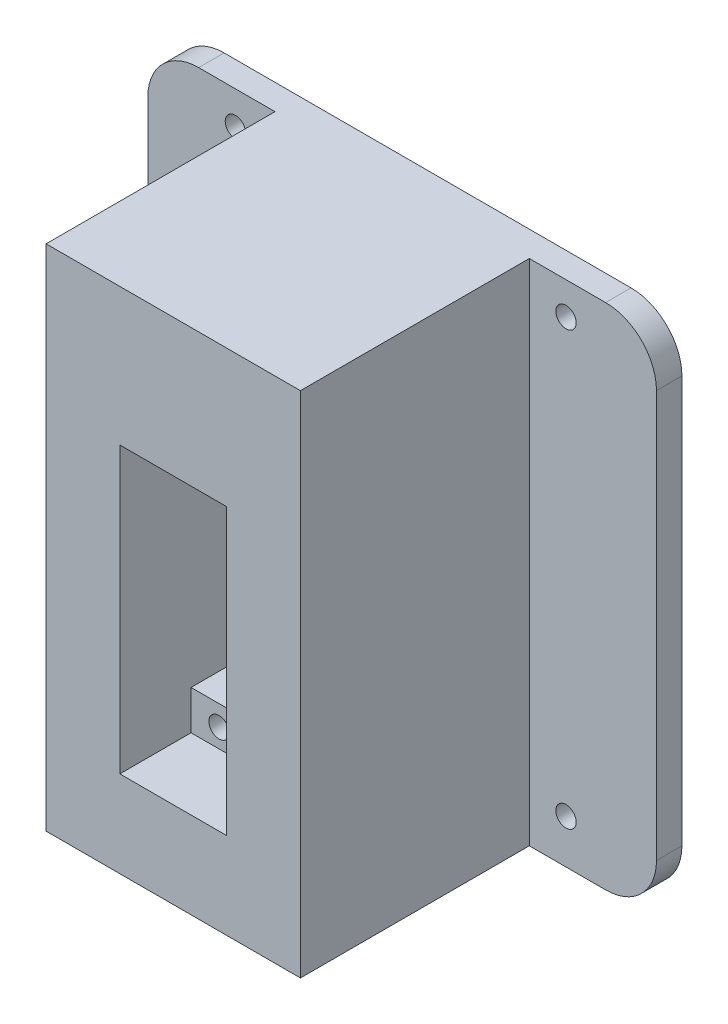
ISO-10303-21;
HEADER;
FILE_DESCRIPTION(('STEP AP214'),'2;1');
FILE_NAME('part.step','',(''),(''),'','','');
FILE_SCHEMA(('AUTOMOTIVE_DESIGN { 1 0 10303 214 1 1 1 1 }'));
ENDSEC;
DATA;
#1=APPLICATION_CONTEXT('core data for automotive mechanical design processes');
#2=APPLICATION_PROTOCOL_DEFINITION('international standard','automotive_design',2000,#1);
#3=PRODUCT_CONTEXT('',#1,'mechanical');
#4=PRODUCT('Part','Part','',(#3));
#5=PRODUCT_RELATED_PRODUCT_CATEGORY('part','',(#4));
#6=PRODUCT_DEFINITION_FORMATION('','',#4);
#7=PRODUCT_DEFINITION_CONTEXT('part definition',#1,'design');
#8=PRODUCT_DEFINITION('design','',#6,#7);
#9=PRODUCT_DEFINITION_SHAPE('','',#8);
#10=(LENGTH_UNIT() NAMED_UNIT(*) SI_UNIT(.MILLI.,.METRE.));
#11=(NAMED_UNIT(*) PLANE_ANGLE_UNIT() SI_UNIT($,.RADIAN.));
#12=(NAMED_UNIT(*) SI_UNIT($,.STERADIAN.) SOLID_ANGLE_UNIT());
#13=UNCERTAINTY_MEASURE_WITH_UNIT(LENGTH_MEASURE(1.E-05),#10,'distance_accuracy_value','');
#14=(GEOMETRIC_REPRESENTATION_CONTEXT(3) GLOBAL_UNCERTAINTY_ASSIGNED_CONTEXT((#13)) GLOBAL_UNIT_ASSIGNED_CONTEXT((#10,
#11,#12)) REPRESENTATION_CONTEXT('',''));
#15=CARTESIAN_POINT('',(0.,0.,0.));
#16=DIRECTION('',(0.,0.,1.));
#17=DIRECTION('',(1.,0.,0.));
#18=AXIS2_PLACEMENT_3D('',#15,#16,#17);
#19=CARTESIAN_POINT('',(-40.,40.,50.));
#20=DIRECTION('',(0.,0.,-1.));
#21=DIRECTION('',(-1.,0.,0.));
#22=AXIS2_PLACEMENT_3D('',#19,#20,#21);
#23=CYLINDRICAL_SURFACE('',#22,9.99999999999999);
#24=CARTESIAN_POINT('',(-40.,40.,5.));
#25=DIRECTION('',(0.,0.,1.));
#26=DIRECTION('',(1.,0.,0.));
#27=AXIS2_PLACEMENT_3D('',#24,#25,#26);
#28=CIRCLE('',#27,9.99999999999999);
#29=CARTESIAN_POINT('',(-39.9999999999999,50.,5.));
#30=VERTEX_POINT('',#29);
#31=CARTESIAN_POINT('',(-50.,39.9999999999999,5.));
#32=VERTEX_POINT('',#31);
#33=EDGE_CURVE('E238',#30,#32,#28,.T.);
#34=ORIENTED_EDGE('',*,*,#33,.F.);
#35=DIRECTION('',(0.,0.,-1.));
#36=VECTOR('',#35,1.);
#37=CARTESIAN_POINT('',(-39.9999999999999,50.,50.));
#38=LINE('',#37,#36);
#39=CARTESIAN_POINT('',(-39.9999999999999,50.,0.));
#40=VERTEX_POINT('',#39);
#41=EDGE_CURVE('E331',#30,#40,#38,.T.);
#42=ORIENTED_EDGE('',*,*,#41,.T.);
#43=CARTESIAN_POINT('',(-40.,40.,0.));
#44=DIRECTION('',(0.,0.,1.));
#45=DIRECTION('',(1.,0.,0.));
#46=AXIS2_PLACEMENT_3D('',#43,#44,#45);
#47=CIRCLE('',#46,9.99999999999999);
#48=CARTESIAN_POINT('',(-50.,39.9999999999999,0.));
#49=VERTEX_POINT('',#48);
#50=EDGE_CURVE('E318',#40,#49,#47,.T.);
#51=ORIENTED_EDGE('',*,*,#50,.T.);
#52=DIRECTION('',(0.,0.,-1.));
#53=VECTOR('',#52,1.);
#54=CARTESIAN_POINT('',(-50.,39.9999999999999,50.));
#55=LINE('',#54,#53);
#56=EDGE_CURVE('E365',#32,#49,#55,.T.);
#57=ORIENTED_EDGE('',*,*,#56,.F.);
#58=EDGE_LOOP('',(#34,#42,#51,#57));
#59=FACE_BOUND('',#58,.T.);
#60=ADVANCED_FACE('F33',(#59),#23,.T.);
#61=CARTESIAN_POINT('',(-50.,39.9999999999999,50.));
#62=DIRECTION('',(1.,0.,0.));
#63=DIRECTION('',(0.,0.,-1.));
#64=AXIS2_PLACEMENT_3D('',#61,#62,#63);
#65=PLANE('',#64);
#66=DIRECTION('',(0.,-1.,0.));
#67=VECTOR('',#66,1.);
#68=CARTESIAN_POINT('',(-50.,-39.9999999999999,5.));
#69=LINE('',#68,#67);
#70=CARTESIAN_POINT('',(-50.,-39.9999999999999,5.));
#71=VERTEX_POINT('',#70);
#72=EDGE_CURVE('E240',#32,#71,#69,.T.);
#73=ORIENTED_EDGE('',*,*,#72,.F.);
#74=ORIENTED_EDGE('',*,*,#56,.T.);
#75=DIRECTION('',(0.,-1.,0.));
#76=VECTOR('',#75,1.);
#77=CARTESIAN_POINT('',(-50.,39.9999999999999,0.));
#78=LINE('',#77,#76);
#79=CARTESIAN_POINT('',(-50.,-39.9999999999999,0.));
#80=VERTEX_POINT('',#79);
#81=EDGE_CURVE('E334',#49,#80,#78,.T.);
#82=ORIENTED_EDGE('',*,*,#81,.T.);
#83=DIRECTION('',(0.,0.,-1.));
#84=VECTOR('',#83,1.);
#85=CARTESIAN_POINT('',(-50.,-39.9999999999999,50.));
#86=LINE('',#85,#84);
#87=EDGE_CURVE('E363',#71,#80,#86,.T.);
#88=ORIENTED_EDGE('',*,*,#87,.F.);
#89=EDGE_LOOP('',(#73,#74,#82,#88));
#90=FACE_BOUND('',#89,.T.);
#91=ADVANCED_FACE('F453',(#90),#65,.F.);
#92=CARTESIAN_POINT('',(-40.,-40.,50.));
#93=DIRECTION('',(0.,0.,-1.));
#94=DIRECTION('',(-1.,0.,0.));
#95=AXIS2_PLACEMENT_3D('',#92,#93,#94);
#96=CYLINDRICAL_SURFACE('',#95,10.);
#97=DIRECTION('',(0.,0.,-1.));
#98=VECTOR('',#97,1.);
#99=CARTESIAN_POINT('',(-39.9999999999999,-50.,50.));
#100=LINE('',#99,#98);
#101=CARTESIAN_POINT('',(-39.9999999999999,-50.,5.));
#102=VERTEX_POINT('',#101);
#103=CARTESIAN_POINT('',(-39.9999999999999,-50.,0.));
#104=VERTEX_POINT('',#103);
#105=EDGE_CURVE('E361',#102,#104,#100,.T.);
#106=ORIENTED_EDGE('',*,*,#105,.F.);
#107=CARTESIAN_POINT('',(-40.,-40.,5.));
#108=DIRECTION('',(0.,0.,1.));
#109=DIRECTION('',(1.,0.,0.));
#110=AXIS2_PLACEMENT_3D('',#107,#108,#109);
#111=CIRCLE('',#110,9.99999999999999);
#112=EDGE_CURVE('E242',#71,#102,#111,.T.);
#113=ORIENTED_EDGE('',*,*,#112,.F.);
#114=ORIENTED_EDGE('',*,*,#87,.T.);
#115=CARTESIAN_POINT('',(-40.,-40.,0.));
#116=DIRECTION('',(0.,0.,-1.));
#117=DIRECTION('',(-1.,0.,0.));
#118=AXIS2_PLACEMENT_3D('',#115,#116,#117);
#119=CIRCLE('',#118,10.);
#120=EDGE_CURVE('E337',#104,#80,#119,.T.);
#121=ORIENTED_EDGE('',*,*,#120,.F.);
#122=EDGE_LOOP('',(#106,#113,#114,#121));
#123=FACE_BOUND('',#122,.T.);
#124=ADVANCED_FACE('F458',(#123),#96,.T.);
#125=CARTESIAN_POINT('',(0.,0.,36.));
#126=DIRECTION('',(0.,0.,1.));
#127=DIRECTION('',(1.,0.,0.));
#128=AXIS2_PLACEMENT_3D('',#125,#126,#127);
#129=PLANE('',#128);
#130=CARTESIAN_POINT('',(5.,19.5,36.));
#131=DIRECTION('',(0.,0.,1.));
#132=DIRECTION('',(1.,0.,0.));
#133=AXIS2_PLACEMENT_3D('',#130,#131,#132);
#134=CIRCLE('',#133,2.);
#135=CARTESIAN_POINT('',(7.,19.5,36.));
#136=VERTEX_POINT('',#135);
#137=EDGE_CURVE('E826',#136,#136,#134,.T.);
#138=ORIENTED_EDGE('',*,*,#137,.F.);
#139=EDGE_LOOP('',(#138));
#140=FACE_BOUND('',#139,.T.);
#141=DIRECTION('',(-1.,0.,0.));
#142=VECTOR('',#141,1.);
#143=CARTESIAN_POINT('',(2.75,16.2200002549946,36.));
#144=LINE('',#143,#142);
#145=CARTESIAN_POINT('',(10.5,16.2200002549946,36.));
#146=VERTEX_POINT('',#145);
#147=CARTESIAN_POINT('',(2.75,16.2200002549946,36.));
#148=VERTEX_POINT('',#147);
#149=EDGE_CURVE('E230',#146,#148,#144,.T.);
#150=ORIENTED_EDGE('',*,*,#149,.F.);
#151=DIRECTION('',(0.,1.,0.));
#152=VECTOR('',#151,1.);
#153=CARTESIAN_POINT('',(10.5,-33.,36.));
#154=LINE('',#153,#152);
#155=CARTESIAN_POINT('',(10.5,23.,36.));
#156=VERTEX_POINT('',#155);
#157=EDGE_CURVE('E296',#146,#156,#154,.T.);
#158=ORIENTED_EDGE('',*,*,#157,.T.);
#159=DIRECTION('',(-1.,0.,0.));
#160=VECTOR('',#159,1.);
#161=CARTESIAN_POINT('',(10.5,23.,36.));
#162=LINE('',#161,#160);
#163=CARTESIAN_POINT('',(2.73061146028868,23.,36.));
#164=VERTEX_POINT('',#163);
#165=EDGE_CURVE('E301',#156,#164,#162,.T.);
#166=ORIENTED_EDGE('',*,*,#165,.T.);
#167=DIRECTION('',(-0.00285965503897239,0.99999591117817,0.));
#168=VECTOR('',#167,1.);
#169=CARTESIAN_POINT('',(2.75,16.2200002549946,36.));
#170=LINE('',#169,#168);
#171=EDGE_CURVE('E256',#148,#164,#170,.T.);
#172=ORIENTED_EDGE('',*,*,#171,.F.);
#173=EDGE_LOOP('',(#150,#158,#166,#172));
#174=FACE_BOUND('',#173,.T.);
#175=ADVANCED_FACE('F412',(#140,#174),#129,.T.);
#176=CARTESIAN_POINT('',(-5.,19.5,36.));
#177=DIRECTION('',(0.,0.,1.));
#178=DIRECTION('',(1.,0.,0.));
#179=AXIS2_PLACEMENT_3D('',#176,#177,#178);
#180=CIRCLE('',#179,2.);
#181=CARTESIAN_POINT('',(-3.,19.5,36.));
#182=VERTEX_POINT('',#181);
#183=EDGE_CURVE('E839',#182,#182,#180,.T.);
#184=ORIENTED_EDGE('',*,*,#183,.F.);
#185=EDGE_LOOP('',(#184));
#186=FACE_BOUND('',#185,.T.);
#187=DIRECTION('',(0.00285965503897193,-0.99999591117817,0.));
#188=VECTOR('',#187,1.);
#189=CARTESIAN_POINT('',(-2.75,16.2200002549947,36.));
#190=LINE('',#189,#188);
#191=CARTESIAN_POINT('',(-2.76938853971132,23.,36.));
#192=VERTEX_POINT('',#191);
#193=CARTESIAN_POINT('',(-2.75,16.2200002549947,36.));
#194=VERTEX_POINT('',#193);
#195=EDGE_CURVE('E262',#192,#194,#190,.T.);
#196=ORIENTED_EDGE('',*,*,#195,.F.);
#197=CARTESIAN_POINT('',(-10.5,23.,36.));
#198=VERTEX_POINT('',#197);
#199=EDGE_CURVE('E300',#192,#198,#162,.T.);
#200=ORIENTED_EDGE('',*,*,#199,.T.);
#201=DIRECTION('',(0.,-1.,0.));
#202=VECTOR('',#201,1.);
#203=CARTESIAN_POINT('',(-10.5,-33.,36.));
#204=LINE('',#203,#202);
#205=CARTESIAN_POINT('',(-10.5,16.2200002549947,36.));
#206=VERTEX_POINT('',#205);
#207=EDGE_CURVE('E289',#198,#206,#204,.T.);
#208=ORIENTED_EDGE('',*,*,#207,.T.);
#209=DIRECTION('',(-1.,0.,0.));
#210=VECTOR('',#209,1.);
#211=CARTESIAN_POINT('',(-2.75,16.2200002549947,36.));
#212=LINE('',#211,#210);
#213=EDGE_CURVE('E266',#194,#206,#212,.T.);
#214=ORIENTED_EDGE('',*,*,#213,.F.);
#215=EDGE_LOOP('',(#196,#200,#208,#214));
#216=FACE_BOUND('',#215,.T.);
#217=ADVANCED_FACE('F429',(#186,#216),#129,.T.);
#218=CARTESIAN_POINT('',(-39.9999999999999,-50.,50.));
#219=DIRECTION('',(0.,1.,0.));
#220=DIRECTION('',(0.,0.,1.));
#221=AXIS2_PLACEMENT_3D('',#218,#219,#220);
#222=PLANE('',#221);
#223=DIRECTION('',(1.,0.,0.));
#224=VECTOR('',#223,1.);
#225=CARTESIAN_POINT('',(40.,-50.,5.));
#226=LINE('',#225,#224);
#227=CARTESIAN_POINT('',(25.,-50.,5.));
#228=VERTEX_POINT('',#227);
#229=CARTESIAN_POINT('',(40.,-50.,5.));
#230=VERTEX_POINT('',#229);
#231=EDGE_CURVE('E211',#228,#230,#226,.T.);
#232=ORIENTED_EDGE('',*,*,#231,.F.);
#233=DIRECTION('',(0.,0.,1.));
#234=VECTOR('',#233,1.);
#235=CARTESIAN_POINT('',(25.,-50.,5.));
#236=LINE('',#235,#234);
#237=CARTESIAN_POINT('',(25.,-50.,50.));
#238=VERTEX_POINT('',#237);
#239=EDGE_CURVE('E197',#228,#238,#236,.T.);
#240=ORIENTED_EDGE('',*,*,#239,.T.);
#241=DIRECTION('',(1.,0.,0.));
#242=VECTOR('',#241,1.);
#243=CARTESIAN_POINT('',(-39.9999999999999,-50.,50.));
#244=LINE('',#243,#242);
#245=CARTESIAN_POINT('',(-25.,-50.,50.));
#246=VERTEX_POINT('',#245);
#247=EDGE_CURVE('E325',#246,#238,#244,.T.);
#248=ORIENTED_EDGE('',*,*,#247,.F.);
#249=DIRECTION('',(0.,0.,1.));
#250=VECTOR('',#249,1.);
#251=CARTESIAN_POINT('',(-25.,-50.,5.));
#252=LINE('',#251,#250);
#253=CARTESIAN_POINT('',(-25.,-50.,5.));
#254=VERTEX_POINT('',#253);
#255=EDGE_CURVE('E55',#254,#246,#252,.T.);
#256=ORIENTED_EDGE('',*,*,#255,.F.);
#257=DIRECTION('',(1.,0.,0.));
#258=VECTOR('',#257,1.);
#259=CARTESIAN_POINT('',(-39.9999999999999,-50.,5.));
#260=LINE('',#259,#258);
#261=EDGE_CURVE('E244',#102,#254,#260,.T.);
#262=ORIENTED_EDGE('',*,*,#261,.F.);
#263=ORIENTED_EDGE('',*,*,#105,.T.);
#264=DIRECTION('',(1.,0.,0.));
#265=VECTOR('',#264,1.);
#266=CARTESIAN_POINT('',(-39.9999999999999,-50.,0.));
#267=LINE('',#266,#265);
#268=CARTESIAN_POINT('',(40.,-50.,0.));
#269=VERTEX_POINT('',#268);
#270=EDGE_CURVE('E340',#104,#269,#267,.T.);
#271=ORIENTED_EDGE('',*,*,#270,.T.);
#272=DIRECTION('',(0.,0.,-1.));
#273=VECTOR('',#272,1.);
#274=CARTESIAN_POINT('',(40.,-50.,50.));
#275=LINE('',#274,#273);
#276=EDGE_CURVE('E218',#230,#269,#275,.T.);
#277=ORIENTED_EDGE('',*,*,#276,.F.);
#278=EDGE_LOOP('',(#232,#240,#248,#256,#262,#263,#271,#277));
#279=FACE_BOUND('',#278,.T.);
#280=ADVANCED_FACE('F216',(#279),#222,.F.);
#281=CARTESIAN_POINT('',(40.,-40.,50.));
#282=DIRECTION('',(0.,0.,-1.));
#283=DIRECTION('',(-1.,0.,0.));
#284=AXIS2_PLACEMENT_3D('',#281,#282,#283);
#285=CYLINDRICAL_SURFACE('',#284,10.);
#286=CARTESIAN_POINT('',(40.,-40.,5.));
#287=DIRECTION('',(0.,0.,1.));
#288=DIRECTION('',(-1.,0.,0.));
#289=AXIS2_PLACEMENT_3D('',#286,#287,#288);
#290=CIRCLE('',#289,9.99999999999999);
#291=CARTESIAN_POINT('',(50.,-39.9999999999999,5.));
#292=VERTEX_POINT('',#291);
#293=EDGE_CURVE('E219',#230,#292,#290,.T.);
#294=ORIENTED_EDGE('',*,*,#293,.F.);
#295=ORIENTED_EDGE('',*,*,#276,.T.);
#296=CARTESIAN_POINT('',(40.,-40.,0.));
#297=DIRECTION('',(0.,0.,-1.));
#298=DIRECTION('',(-1.,0.,0.));
#299=AXIS2_PLACEMENT_3D('',#296,#297,#298);
#300=CIRCLE('',#299,10.);
#301=CARTESIAN_POINT('',(50.,-39.9999999999999,0.));
#302=VERTEX_POINT('',#301);
#303=EDGE_CURVE('E342',#302,#269,#300,.T.);
#304=ORIENTED_EDGE('',*,*,#303,.F.);
#305=DIRECTION('',(0.,0.,-1.));
#306=VECTOR('',#305,1.);
#307=CARTESIAN_POINT('',(50.,-39.9999999999999,50.));
#308=LINE('',#307,#306);
#309=EDGE_CURVE('E358',#292,#302,#308,.T.);
#310=ORIENTED_EDGE('',*,*,#309,.F.);
#311=EDGE_LOOP('',(#294,#295,#304,#310));
#312=FACE_BOUND('',#311,.T.);
#313=ADVANCED_FACE('F485',(#312),#285,.T.);
#314=CARTESIAN_POINT('',(50.,39.9999999999999,50.));
#315=DIRECTION('',(1.,0.,0.));
#316=DIRECTION('',(0.,1.,0.));
#317=AXIS2_PLACEMENT_3D('',#314,#315,#316);
#318=PLANE('',#317);
#319=DIRECTION('',(0.,1.,0.));
#320=VECTOR('',#319,1.);
#321=CARTESIAN_POINT('',(50.,-39.9999999999999,5.));
#322=LINE('',#321,#320);
#323=CARTESIAN_POINT('',(50.,39.9999999999999,5.));
#324=VERTEX_POINT('',#323);
#325=EDGE_CURVE('E221',#292,#324,#322,.T.);
#326=ORIENTED_EDGE('',*,*,#325,.F.);
#327=ORIENTED_EDGE('',*,*,#309,.T.);
#328=DIRECTION('',(0.,-1.,0.));
#329=VECTOR('',#328,1.);
#330=CARTESIAN_POINT('',(50.,39.9999999999999,0.));
#331=LINE('',#330,#329);
#332=CARTESIAN_POINT('',(50.,39.9999999999999,0.));
#333=VERTEX_POINT('',#332);
#334=EDGE_CURVE('E345',#333,#302,#331,.T.);
#335=ORIENTED_EDGE('',*,*,#334,.F.);
#336=DIRECTION('',(0.,0.,-1.));
#337=VECTOR('',#336,1.);
#338=CARTESIAN_POINT('',(50.,39.9999999999999,50.));
#339=LINE('',#338,#337);
#340=EDGE_CURVE('E356',#324,#333,#339,.T.);
#341=ORIENTED_EDGE('',*,*,#340,.F.);
#342=EDGE_LOOP('',(#326,#327,#335,#341));
#343=FACE_BOUND('',#342,.T.);
#344=ADVANCED_FACE('F490',(#343),#318,.T.);
#345=CARTESIAN_POINT('',(40.,40.,50.));
#346=DIRECTION('',(0.,0.,-1.));
#347=DIRECTION('',(-1.,0.,0.));
#348=AXIS2_PLACEMENT_3D('',#345,#346,#347);
#349=CYLINDRICAL_SURFACE('',#348,10.);
#350=DIRECTION('',(0.,0.,-1.));
#351=VECTOR('',#350,1.);
#352=CARTESIAN_POINT('',(39.9999999999999,50.,50.));
#353=LINE('',#352,#351);
#354=CARTESIAN_POINT('',(40.,50.,5.));
#355=VERTEX_POINT('',#354);
#356=CARTESIAN_POINT('',(39.9999999999999,50.,0.));
#357=VERTEX_POINT('',#356);
#358=EDGE_CURVE('E354',#355,#357,#353,.T.);
#359=ORIENTED_EDGE('',*,*,#358,.F.);
#360=CARTESIAN_POINT('',(40.,40.,5.));
#361=DIRECTION('',(0.,0.,1.));
#362=DIRECTION('',(-1.,0.,0.));
#363=AXIS2_PLACEMENT_3D('',#360,#361,#362);
#364=CIRCLE('',#363,9.99999999999999);
#365=EDGE_CURVE('E226',#324,#355,#364,.T.);
#366=ORIENTED_EDGE('',*,*,#365,.F.);
#367=ORIENTED_EDGE('',*,*,#340,.T.);
#368=CARTESIAN_POINT('',(40.,40.,0.));
#369=DIRECTION('',(0.,0.,1.));
#370=DIRECTION('',(1.,0.,0.));
#371=AXIS2_PLACEMENT_3D('',#368,#369,#370);
#372=CIRCLE('',#371,10.);
#373=EDGE_CURVE('E348',#333,#357,#372,.T.);
#374=ORIENTED_EDGE('',*,*,#373,.T.);
#375=EDGE_LOOP('',(#359,#366,#367,#374));
#376=FACE_BOUND('',#375,.T.);
#377=ADVANCED_FACE('F492',(#376),#349,.T.);
#378=CARTESIAN_POINT('',(-39.9999999999999,50.,50.));
#379=DIRECTION('',(0.,1.,0.));
#380=DIRECTION('',(0.,0.,1.));
#381=AXIS2_PLACEMENT_3D('',#378,#379,#380);
#382=PLANE('',#381);
#383=DIRECTION('',(0.,0.,1.));
#384=VECTOR('',#383,1.);
#385=CARTESIAN_POINT('',(25.,50.,5.));
#386=LINE('',#385,#384);
#387=CARTESIAN_POINT('',(25.,50.,5.));
#388=VERTEX_POINT('',#387);
#389=CARTESIAN_POINT('',(25.,50.,50.));
#390=VERTEX_POINT('',#389);
#391=EDGE_CURVE('E47',#388,#390,#386,.T.);
#392=ORIENTED_EDGE('',*,*,#391,.F.);
#393=DIRECTION('',(-1.,0.,0.));
#394=VECTOR('',#393,1.);
#395=CARTESIAN_POINT('',(40.,50.,5.));
#396=LINE('',#395,#394);
#397=EDGE_CURVE('E207',#355,#388,#396,.T.);
#398=ORIENTED_EDGE('',*,*,#397,.F.);
#399=ORIENTED_EDGE('',*,*,#358,.T.);
#400=DIRECTION('',(1.,0.,0.));
#401=VECTOR('',#400,1.);
#402=CARTESIAN_POINT('',(-39.9999999999999,50.,0.));
#403=LINE('',#402,#401);
#404=EDGE_CURVE('E328',#40,#357,#403,.T.);
#405=ORIENTED_EDGE('',*,*,#404,.F.);
#406=ORIENTED_EDGE('',*,*,#41,.F.);
#407=DIRECTION('',(-1.,0.,0.));
#408=VECTOR('',#407,1.);
#409=CARTESIAN_POINT('',(-39.9999999999999,50.,5.));
#410=LINE('',#409,#408);
#411=CARTESIAN_POINT('',(-25.,50.,5.));
#412=VERTEX_POINT('',#411);
#413=EDGE_CURVE('E235',#412,#30,#410,.T.);
#414=ORIENTED_EDGE('',*,*,#413,.F.);
#415=DIRECTION('',(0.,0.,1.));
#416=VECTOR('',#415,1.);
#417=CARTESIAN_POINT('',(-25.,50.,5.));
#418=LINE('',#417,#416);
#419=CARTESIAN_POINT('',(-25.,50.,50.));
#420=VERTEX_POINT('',#419);
#421=EDGE_CURVE('E247',#412,#420,#418,.T.);
#422=ORIENTED_EDGE('',*,*,#421,.T.);
#423=DIRECTION('',(1.,0.,0.));
#424=VECTOR('',#423,1.);
#425=CARTESIAN_POINT('',(-39.9999999999999,50.,50.));
#426=LINE('',#425,#424);
#427=EDGE_CURVE('E327',#420,#390,#426,.T.);
#428=ORIENTED_EDGE('',*,*,#427,.T.);
#429=EDGE_LOOP('',(#392,#398,#399,#405,#406,#414,#422,#428));
#430=FACE_BOUND('',#429,.T.);
#431=ADVANCED_FACE('F469',(#430),#382,.T.);
#432=CARTESIAN_POINT('',(-40.,40.,50.));
#433=DIRECTION('',(0.,0.,1.));
#434=DIRECTION('',(1.,0.,0.));
#435=AXIS2_PLACEMENT_3D('',#432,#433,#434);
#436=PLANE('',#435);
#437=DIRECTION('',(0.,-1.,0.));
#438=VECTOR('',#437,1.);
#439=CARTESIAN_POINT('',(25.,-50.,50.));
#440=LINE('',#439,#438);
#441=EDGE_CURVE('E202',#390,#238,#440,.T.);
#442=ORIENTED_EDGE('',*,*,#441,.F.);
#443=ORIENTED_EDGE('',*,*,#427,.F.);
#444=DIRECTION('',(0.,1.,0.));
#445=VECTOR('',#444,1.);
#446=CARTESIAN_POINT('',(-25.,-50.,50.));
#447=LINE('',#446,#445);
#448=EDGE_CURVE('E236',#246,#420,#447,.T.);
#449=ORIENTED_EDGE('',*,*,#448,.F.);
#450=ORIENTED_EDGE('',*,*,#247,.T.);
#451=EDGE_LOOP('',(#442,#443,#449,#450));
#452=FACE_BOUND('',#451,.T.);
#453=DIRECTION('',(0.,-1.,0.));
#454=VECTOR('',#453,1.);
#455=CARTESIAN_POINT('',(-10.5,-33.,50.));
#456=LINE('',#455,#454);
#457=CARTESIAN_POINT('',(-10.5,23.,50.));
#458=VERTEX_POINT('',#457);
#459=CARTESIAN_POINT('',(-10.5,-33.,50.));
#460=VERTEX_POINT('',#459);
#461=EDGE_CURVE('E275',#458,#460,#456,.T.);
#462=ORIENTED_EDGE('',*,*,#461,.F.);
#463=DIRECTION('',(-1.,0.,0.));
#464=VECTOR('',#463,1.);
#465=CARTESIAN_POINT('',(10.5,23.,50.));
#466=LINE('',#465,#464);
#467=CARTESIAN_POINT('',(10.5,23.,50.));
#468=VERTEX_POINT('',#467);
#469=EDGE_CURVE('E313',#468,#458,#466,.T.);
#470=ORIENTED_EDGE('',*,*,#469,.F.);
#471=DIRECTION('',(0.,1.,0.));
#472=VECTOR('',#471,1.);
#473=CARTESIAN_POINT('',(10.5,-33.,50.));
#474=LINE('',#473,#472);
#475=CARTESIAN_POINT('',(10.5,-33.,50.));
#476=VERTEX_POINT('',#475);
#477=EDGE_CURVE('E310',#476,#468,#474,.T.);
#478=ORIENTED_EDGE('',*,*,#477,.F.);
#479=DIRECTION('',(1.,0.,0.));
#480=VECTOR('',#479,1.);
#481=CARTESIAN_POINT('',(10.5,-33.,50.));
#482=LINE('',#481,#480);
#483=EDGE_CURVE('E307',#460,#476,#482,.T.);
#484=ORIENTED_EDGE('',*,*,#483,.F.);
#485=EDGE_LOOP('',(#462,#470,#478,#484));
#486=FACE_BOUND('',#485,.T.);
#487=ADVANCED_FACE('F495',(#452,#486),#436,.T.);
#488=CARTESIAN_POINT('',(-40.,40.,0.));
#489=DIRECTION('',(0.,0.,1.));
#490=DIRECTION('',(1.,0.,0.));
#491=AXIS2_PLACEMENT_3D('',#488,#489,#490);
#492=PLANE('',#491);
#493=CARTESIAN_POINT('',(32.2162912847254,43.635084909441,0.));
#494=DIRECTION('',(0.,0.,1.));
#495=DIRECTION('',(1.,0.,0.));
#496=AXIS2_PLACEMENT_3D('',#493,#494,#495);
#497=CIRCLE('',#496,2.);
#498=CARTESIAN_POINT('',(34.2162912847254,43.635084909441,0.));
#499=VERTEX_POINT('',#498);
#500=EDGE_CURVE('E817',#499,#499,#497,.T.);
#501=ORIENTED_EDGE('',*,*,#500,.T.);
#502=EDGE_LOOP('',(#501));
#503=FACE_BOUND('',#502,.T.);
#504=CARTESIAN_POINT('',(32.2162912847254,-41.364915090559,0.));
#505=DIRECTION('',(0.,0.,1.));
#506=DIRECTION('',(1.,0.,0.));
#507=AXIS2_PLACEMENT_3D('',#504,#505,#506);
#508=CIRCLE('',#507,2.);
#509=CARTESIAN_POINT('',(34.2162912847254,-41.364915090559,0.));
#510=VERTEX_POINT('',#509);
#511=EDGE_CURVE('E807',#510,#510,#508,.T.);
#512=ORIENTED_EDGE('',*,*,#511,.T.);
#513=EDGE_LOOP('',(#512));
#514=FACE_BOUND('',#513,.T.);
#515=CARTESIAN_POINT('',(-32.7837087152745,-41.5176233925796,0.));
#516=DIRECTION('',(0.,0.,1.));
#517=DIRECTION('',(1.,0.,0.));
#518=AXIS2_PLACEMENT_3D('',#515,#516,#517);
#519=CIRCLE('',#518,2.);
#520=CARTESIAN_POINT('',(-30.7837087152745,-41.5176233925796,0.));
#521=VERTEX_POINT('',#520);
#522=EDGE_CURVE('E803',#521,#521,#519,.T.);
#523=ORIENTED_EDGE('',*,*,#522,.T.);
#524=EDGE_LOOP('',(#523));
#525=FACE_BOUND('',#524,.T.);
#526=CARTESIAN_POINT('',(-32.7837087152745,43.4823766074204,0.));
#527=DIRECTION('',(0.,0.,1.));
#528=DIRECTION('',(1.,0.,0.));
#529=AXIS2_PLACEMENT_3D('',#526,#527,#528);
#530=CIRCLE('',#529,2.);
#531=CARTESIAN_POINT('',(-30.7837087152745,43.4823766074204,0.));
#532=VERTEX_POINT('',#531);
#533=EDGE_CURVE('E823',#532,#532,#530,.T.);
#534=ORIENTED_EDGE('',*,*,#533,.T.);
#535=EDGE_LOOP('',(#534));
#536=FACE_BOUND('',#535,.T.);
#537=DIRECTION('',(1.,0.,0.));
#538=VECTOR('',#537,1.);
#539=CARTESIAN_POINT('',(-40.,-25.2799997450053,0.));
#540=LINE('',#539,#538);
#541=CARTESIAN_POINT('',(-10.5,-25.2799997450054,0.));
#542=VERTEX_POINT('',#541);
#543=CARTESIAN_POINT('',(10.5,-25.2799997450054,0.));
#544=VERTEX_POINT('',#543);
#545=EDGE_CURVE('E40',#542,#544,#540,.T.);
#546=ORIENTED_EDGE('',*,*,#545,.T.);
#547=DIRECTION('',(0.,1.,0.));
#548=VECTOR('',#547,1.);
#549=CARTESIAN_POINT('',(10.5,40.,0.));
#550=LINE('',#549,#548);
#551=CARTESIAN_POINT('',(10.5,16.2200002549946,0.));
#552=VERTEX_POINT('',#551);
#553=EDGE_CURVE('E11',#544,#552,#550,.T.);
#554=ORIENTED_EDGE('',*,*,#553,.T.);
#555=DIRECTION('',(-1.,0.,0.));
#556=VECTOR('',#555,1.);
#557=CARTESIAN_POINT('',(-40.,16.2200002549946,0.));
#558=LINE('',#557,#556);
#559=CARTESIAN_POINT('',(2.75,16.2200002549946,0.));
#560=VERTEX_POINT('',#559);
#561=EDGE_CURVE('E367',#552,#560,#558,.T.);
#562=ORIENTED_EDGE('',*,*,#561,.T.);
#563=DIRECTION('',(-0.00285965503897239,0.99999591117817,0.));
#564=VECTOR('',#563,1.);
#565=CARTESIAN_POINT('',(2.68164808840117,40.12205528909,0.));
#566=LINE('',#565,#564);
#567=CARTESIAN_POINT('',(2.72855258720771,23.7199695888309,0.));
#568=VERTEX_POINT('',#567);
#569=EDGE_CURVE('E370',#560,#568,#566,.T.);
#570=ORIENTED_EDGE('',*,*,#569,.T.);
#571=DIRECTION('',(-1.,0.,0.));
#572=VECTOR('',#571,1.);
#573=CARTESIAN_POINT('',(-40.,23.7199695888309,0.));
#574=LINE('',#573,#572);
#575=CARTESIAN_POINT('',(-2.77144741279229,23.7199695888309,0.));
#576=VERTEX_POINT('',#575);
#577=EDGE_CURVE('E373',#568,#576,#574,.T.);
#578=ORIENTED_EDGE('',*,*,#577,.T.);
#579=DIRECTION('',(0.00285965503897193,-0.99999591117817,0.));
#580=VECTOR('',#579,1.);
#581=CARTESIAN_POINT('',(-2.81830693465065,40.106327250685,0.));
#582=LINE('',#581,#580);
#583=CARTESIAN_POINT('',(-2.75,16.2200002549947,0.));
#584=VERTEX_POINT('',#583);
#585=EDGE_CURVE('E376',#576,#584,#582,.T.);
#586=ORIENTED_EDGE('',*,*,#585,.T.);
#587=DIRECTION('',(-1.,0.,0.));
#588=VECTOR('',#587,1.);
#589=CARTESIAN_POINT('',(-40.,16.2200002549946,0.));
#590=LINE('',#589,#588);
#591=CARTESIAN_POINT('',(-10.5,16.2200002549947,0.));
#592=VERTEX_POINT('',#591);
#593=EDGE_CURVE('E379',#584,#592,#590,.T.);
#594=ORIENTED_EDGE('',*,*,#593,.T.);
#595=DIRECTION('',(0.,-1.,0.));
#596=VECTOR('',#595,1.);
#597=CARTESIAN_POINT('',(-10.5,40.,0.));
#598=LINE('',#597,#596);
#599=EDGE_CURVE('E382',#592,#542,#598,.T.);
#600=ORIENTED_EDGE('',*,*,#599,.T.);
#601=EDGE_LOOP('',(#546,#554,#562,#570,#578,#586,#594,#600));
#602=FACE_BOUND('',#601,.T.);
#603=ORIENTED_EDGE('',*,*,#50,.F.);
#604=ORIENTED_EDGE('',*,*,#404,.T.);
#605=ORIENTED_EDGE('',*,*,#373,.F.);
#606=ORIENTED_EDGE('',*,*,#334,.T.);
#607=ORIENTED_EDGE('',*,*,#303,.T.);
#608=ORIENTED_EDGE('',*,*,#270,.F.);
#609=ORIENTED_EDGE('',*,*,#120,.T.);
#610=ORIENTED_EDGE('',*,*,#81,.F.);
#611=EDGE_LOOP('',(#603,#604,#605,#606,#607,#608,#609,#610));
#612=FACE_BOUND('',#611,.T.);
#613=ADVANCED_FACE('F386',(#503,#514,#525,#536,#602,#612),#492,.F.);
#614=CARTESIAN_POINT('',(-10.5,-33.,36.));
#615=DIRECTION('',(-1.,0.,0.));
#616=DIRECTION('',(0.,0.,1.));
#617=AXIS2_PLACEMENT_3D('',#614,#615,#616);
#618=PLANE('',#617);
#619=ORIENTED_EDGE('',*,*,#461,.T.);
#620=DIRECTION('',(0.,0.,1.));
#621=VECTOR('',#620,1.);
#622=CARTESIAN_POINT('',(-10.5,-33.,36.));
#623=LINE('',#622,#621);
#624=CARTESIAN_POINT('',(-10.5,-33.,36.));
#625=VERTEX_POINT('',#624);
#626=EDGE_CURVE('E304',#625,#460,#623,.T.);
#627=ORIENTED_EDGE('',*,*,#626,.F.);
#628=CARTESIAN_POINT('',(-10.5,-25.2799997450054,36.));
#629=VERTEX_POINT('',#628);
#630=EDGE_CURVE('E293',#629,#625,#204,.T.);
#631=ORIENTED_EDGE('',*,*,#630,.F.);
#632=DIRECTION('',(0.,0.,1.));
#633=VECTOR('',#632,1.);
#634=CARTESIAN_POINT('',(-10.5,-25.2799997450054,-4.));
#635=LINE('',#634,#633);
#636=EDGE_CURVE('E276',#542,#629,#635,.T.);
#637=ORIENTED_EDGE('',*,*,#636,.F.);
#638=ORIENTED_EDGE('',*,*,#599,.F.);
#639=DIRECTION('',(0.,0.,1.));
#640=VECTOR('',#639,1.);
#641=CARTESIAN_POINT('',(-10.5,16.2200002549947,-4.));
#642=LINE('',#641,#640);
#643=EDGE_CURVE('E278',#592,#206,#642,.T.);
#644=ORIENTED_EDGE('',*,*,#643,.T.);
#645=ORIENTED_EDGE('',*,*,#207,.F.);
#646=DIRECTION('',(0.,0.,1.));
#647=VECTOR('',#646,1.);
#648=CARTESIAN_POINT('',(-10.5,23.,36.));
#649=LINE('',#648,#647);
#650=EDGE_CURVE('E316',#198,#458,#649,.T.);
#651=ORIENTED_EDGE('',*,*,#650,.T.);
#652=EDGE_LOOP('',(#619,#627,#631,#637,#638,#644,#645,#651));
#653=FACE_BOUND('',#652,.T.);
#654=ADVANCED_FACE('F395',(#653),#618,.F.);
#655=CARTESIAN_POINT('',(10.5,23.,36.));
#656=DIRECTION('',(0.,1.,0.));
#657=DIRECTION('',(-1.,0.,0.));
#658=AXIS2_PLACEMENT_3D('',#655,#656,#657);
#659=PLANE('',#658);
#660=ORIENTED_EDGE('',*,*,#469,.T.);
#661=ORIENTED_EDGE('',*,*,#650,.F.);
#662=ORIENTED_EDGE('',*,*,#199,.F.);
#663=EDGE_CURVE('E305',#164,#192,#162,.T.);
#664=ORIENTED_EDGE('',*,*,#663,.F.);
#665=ORIENTED_EDGE('',*,*,#165,.F.);
#666=DIRECTION('',(0.,0.,1.));
#667=VECTOR('',#666,1.);
#668=CARTESIAN_POINT('',(10.5,23.,36.));
#669=LINE('',#668,#667);
#670=EDGE_CURVE('E319',#156,#468,#669,.T.);
#671=ORIENTED_EDGE('',*,*,#670,.T.);
#672=EDGE_LOOP('',(#660,#661,#662,#664,#665,#671));
#673=FACE_BOUND('',#672,.T.);
#674=ADVANCED_FACE('F423',(#673),#659,.F.);
#675=CARTESIAN_POINT('',(10.5,-33.,36.));
#676=DIRECTION('',(1.,0.,0.));
#677=DIRECTION('',(0.,0.,-1.));
#678=AXIS2_PLACEMENT_3D('',#675,#676,#677);
#679=PLANE('',#678);
#680=ORIENTED_EDGE('',*,*,#477,.T.);
#681=ORIENTED_EDGE('',*,*,#670,.F.);
#682=ORIENTED_EDGE('',*,*,#157,.F.);
#683=DIRECTION('',(0.,0.,1.));
#684=VECTOR('',#683,1.);
#685=CARTESIAN_POINT('',(10.5,16.2200002549946,-4.));
#686=LINE('',#685,#684);
#687=EDGE_CURVE('E272',#552,#146,#686,.T.);
#688=ORIENTED_EDGE('',*,*,#687,.F.);
#689=ORIENTED_EDGE('',*,*,#553,.F.);
#690=DIRECTION('',(0.,0.,1.));
#691=VECTOR('',#690,1.);
#692=CARTESIAN_POINT('',(10.5,-25.2799997450054,-4.));
#693=LINE('',#692,#691);
#694=CARTESIAN_POINT('',(10.5,-25.2799997450054,36.));
#695=VERTEX_POINT('',#694);
#696=EDGE_CURVE('E273',#544,#695,#693,.T.);
#697=ORIENTED_EDGE('',*,*,#696,.T.);
#698=CARTESIAN_POINT('',(10.5,-33.,36.));
#699=VERTEX_POINT('',#698);
#700=EDGE_CURVE('E297',#699,#695,#154,.T.);
#701=ORIENTED_EDGE('',*,*,#700,.F.);
#702=DIRECTION('',(0.,0.,1.));
#703=VECTOR('',#702,1.);
#704=CARTESIAN_POINT('',(10.5,-33.,36.));
#705=LINE('',#704,#703);
#706=EDGE_CURVE('E321',#699,#476,#705,.T.);
#707=ORIENTED_EDGE('',*,*,#706,.T.);
#708=EDGE_LOOP('',(#680,#681,#682,#688,#689,#697,#701,#707));
#709=FACE_BOUND('',#708,.T.);
#710=ADVANCED_FACE('F403',(#709),#679,.F.);
#711=CARTESIAN_POINT('',(10.5,-33.,36.));
#712=DIRECTION('',(0.,-1.,0.));
#713=DIRECTION('',(0.,0.,-1.));
#714=AXIS2_PLACEMENT_3D('',#711,#712,#713);
#715=PLANE('',#714);
#716=ORIENTED_EDGE('',*,*,#483,.T.);
#717=ORIENTED_EDGE('',*,*,#706,.F.);
#718=DIRECTION('',(1.,0.,0.));
#719=VECTOR('',#718,1.);
#720=CARTESIAN_POINT('',(10.5,-33.,36.));
#721=LINE('',#720,#719);
#722=EDGE_CURVE('E292',#625,#699,#721,.T.);
#723=ORIENTED_EDGE('',*,*,#722,.F.);
#724=ORIENTED_EDGE('',*,*,#626,.T.);
#725=EDGE_LOOP('',(#716,#717,#723,#724));
#726=FACE_BOUND('',#725,.T.);
#727=ADVANCED_FACE('F653',(#726),#715,.F.);
#728=CARTESIAN_POINT('',(-5.,-29.3,36.));
#729=DIRECTION('',(0.,0.,1.));
#730=DIRECTION('',(1.,0.,0.));
#731=AXIS2_PLACEMENT_3D('',#728,#729,#730);
#732=CIRCLE('',#731,2.);
#733=CARTESIAN_POINT('',(-3.,-29.3,36.));
#734=VERTEX_POINT('',#733);
#735=EDGE_CURVE('E833',#734,#734,#732,.T.);
#736=ORIENTED_EDGE('',*,*,#735,.F.);
#737=EDGE_LOOP('',(#736));
#738=FACE_BOUND('',#737,.T.);
#739=CARTESIAN_POINT('',(5.,-29.3,36.));
#740=DIRECTION('',(0.,0.,1.));
#741=DIRECTION('',(1.,0.,0.));
#742=AXIS2_PLACEMENT_3D('',#739,#740,#741);
#743=CIRCLE('',#742,2.);
#744=CARTESIAN_POINT('',(7.,-29.3,36.));
#745=VERTEX_POINT('',#744);
#746=EDGE_CURVE('E832',#745,#745,#743,.T.);
#747=ORIENTED_EDGE('',*,*,#746,.F.);
#748=EDGE_LOOP('',(#747));
#749=FACE_BOUND('',#748,.T.);
#750=DIRECTION('',(1.,0.,0.));
#751=VECTOR('',#750,1.);
#752=CARTESIAN_POINT('',(-10.5,-25.2799997450054,36.));
#753=LINE('',#752,#751);
#754=EDGE_CURVE('E269',#629,#695,#753,.T.);
#755=ORIENTED_EDGE('',*,*,#754,.F.);
#756=ORIENTED_EDGE('',*,*,#630,.T.);
#757=ORIENTED_EDGE('',*,*,#722,.T.);
#758=ORIENTED_EDGE('',*,*,#700,.T.);
#759=EDGE_LOOP('',(#755,#756,#757,#758));
#760=FACE_BOUND('',#759,.T.);
#761=ADVANCED_FACE('F400',(#738,#749,#760),#129,.T.);
#762=CARTESIAN_POINT('',(-10.5,-25.2799997450054,-4.));
#763=DIRECTION('',(0.,-1.,0.));
#764=DIRECTION('',(0.,0.,-1.));
#765=AXIS2_PLACEMENT_3D('',#762,#763,#764);
#766=PLANE('',#765);
#767=ORIENTED_EDGE('',*,*,#636,.T.);
#768=ORIENTED_EDGE('',*,*,#754,.T.);
#769=ORIENTED_EDGE('',*,*,#696,.F.);
#770=ORIENTED_EDGE('',*,*,#545,.F.);
#771=EDGE_LOOP('',(#767,#768,#769,#770));
#772=FACE_BOUND('',#771,.T.);
#773=ADVANCED_FACE('F391',(#772),#766,.F.);
#774=CARTESIAN_POINT('',(-2.75,16.2200002549947,-4.));
#775=DIRECTION('',(0.,1.,0.));
#776=DIRECTION('',(-1.,0.,0.));
#777=AXIS2_PLACEMENT_3D('',#774,#775,#776);
#778=PLANE('',#777);
#779=DIRECTION('',(0.,0.,1.));
#780=VECTOR('',#779,1.);
#781=CARTESIAN_POINT('',(-2.75,16.2200002549947,-4.));
#782=LINE('',#781,#780);
#783=EDGE_CURVE('E280',#584,#194,#782,.T.);
#784=ORIENTED_EDGE('',*,*,#783,.T.);
#785=ORIENTED_EDGE('',*,*,#213,.T.);
#786=ORIENTED_EDGE('',*,*,#643,.F.);
#787=ORIENTED_EDGE('',*,*,#593,.F.);
#788=EDGE_LOOP('',(#784,#785,#786,#787));
#789=FACE_BOUND('',#788,.T.);
#790=ADVANCED_FACE('F436',(#789),#778,.F.);
#791=CARTESIAN_POINT('',(-2.75,16.2200002549947,-4.));
#792=DIRECTION('',(-0.99999591117817,-0.00285965503897193,0.));
#793=DIRECTION('',(0.00285965503897193,-0.99999591117817,0.));
#794=AXIS2_PLACEMENT_3D('',#791,#792,#793);
#795=PLANE('',#794);
#796=DIRECTION('',(0.,0.,1.));
#797=VECTOR('',#796,1.);
#798=CARTESIAN_POINT('',(-2.77144741279229,23.7199695888309,-4.));
#799=LINE('',#798,#797);
#800=CARTESIAN_POINT('',(-2.77144741279229,23.7199695888309,36.));
#801=VERTEX_POINT('',#800);
#802=EDGE_CURVE('E282',#576,#801,#799,.T.);
#803=ORIENTED_EDGE('',*,*,#802,.T.);
#804=EDGE_CURVE('E263',#801,#192,#190,.T.);
#805=ORIENTED_EDGE('',*,*,#804,.T.);
#806=ORIENTED_EDGE('',*,*,#195,.T.);
#807=ORIENTED_EDGE('',*,*,#783,.F.);
#808=ORIENTED_EDGE('',*,*,#585,.F.);
#809=EDGE_LOOP('',(#803,#805,#806,#807,#808));
#810=FACE_BOUND('',#809,.T.);
#811=ADVANCED_FACE('F439',(#810),#795,.F.);
#812=CARTESIAN_POINT('',(-2.77144741279229,23.7199695888309,-4.));
#813=DIRECTION('',(0.,1.,0.));
#814=DIRECTION('',(0.,0.,1.));
#815=AXIS2_PLACEMENT_3D('',#812,#813,#814);
#816=PLANE('',#815);
#817=DIRECTION('',(0.,0.,1.));
#818=VECTOR('',#817,1.);
#819=CARTESIAN_POINT('',(2.72855258720771,23.7199695888309,-4.));
#820=LINE('',#819,#818);
#821=CARTESIAN_POINT('',(2.72855258720771,23.7199695888309,36.));
#822=VERTEX_POINT('',#821);
#823=EDGE_CURVE('E284',#568,#822,#820,.T.);
#824=ORIENTED_EDGE('',*,*,#823,.T.);
#825=DIRECTION('',(-1.,0.,0.));
#826=VECTOR('',#825,1.);
#827=CARTESIAN_POINT('',(-2.77144741279229,23.7199695888309,36.));
#828=LINE('',#827,#826);
#829=EDGE_CURVE('E259',#822,#801,#828,.T.);
#830=ORIENTED_EDGE('',*,*,#829,.T.);
#831=ORIENTED_EDGE('',*,*,#802,.F.);
#832=ORIENTED_EDGE('',*,*,#577,.F.);
#833=EDGE_LOOP('',(#824,#830,#831,#832));
#834=FACE_BOUND('',#833,.T.);
#835=ADVANCED_FACE('F443',(#834),#816,.F.);
#836=CARTESIAN_POINT('',(2.75,16.2200002549946,-4.));
#837=DIRECTION('',(0.99999591117817,0.00285965503897239,0.));
#838=DIRECTION('',(-0.00285965503897239,0.99999591117817,0.));
#839=AXIS2_PLACEMENT_3D('',#836,#837,#838);
#840=PLANE('',#839);
#841=DIRECTION('',(0.,0.,1.));
#842=VECTOR('',#841,1.);
#843=CARTESIAN_POINT('',(2.75,16.2200002549946,-4.));
#844=LINE('',#843,#842);
#845=EDGE_CURVE('E286',#560,#148,#844,.T.);
#846=ORIENTED_EDGE('',*,*,#845,.T.);
#847=ORIENTED_EDGE('',*,*,#171,.T.);
#848=EDGE_CURVE('E255',#164,#822,#170,.T.);
#849=ORIENTED_EDGE('',*,*,#848,.T.);
#850=ORIENTED_EDGE('',*,*,#823,.F.);
#851=ORIENTED_EDGE('',*,*,#569,.F.);
#852=EDGE_LOOP('',(#846,#847,#849,#850,#851));
#853=FACE_BOUND('',#852,.T.);
#854=ADVANCED_FACE('F417',(#853),#840,.F.);
#855=CARTESIAN_POINT('',(2.75,16.2200002549946,-4.));
#856=DIRECTION('',(0.,1.,0.));
#857=DIRECTION('',(0.,0.,1.));
#858=AXIS2_PLACEMENT_3D('',#855,#856,#857);
#859=PLANE('',#858);
#860=ORIENTED_EDGE('',*,*,#687,.T.);
#861=ORIENTED_EDGE('',*,*,#149,.T.);
#862=ORIENTED_EDGE('',*,*,#845,.F.);
#863=ORIENTED_EDGE('',*,*,#561,.F.);
#864=EDGE_LOOP('',(#860,#861,#862,#863));
#865=FACE_BOUND('',#864,.T.);
#866=ADVANCED_FACE('F409',(#865),#859,.F.);
#867=CARTESIAN_POINT('',(0.,0.,36.));
#868=DIRECTION('',(0.,0.,1.));
#869=DIRECTION('',(1.,0.,0.));
#870=AXIS2_PLACEMENT_3D('',#867,#868,#869);
#871=PLANE('',#870);
#872=ORIENTED_EDGE('',*,*,#663,.T.);
#873=ORIENTED_EDGE('',*,*,#804,.F.);
#874=ORIENTED_EDGE('',*,*,#829,.F.);
#875=ORIENTED_EDGE('',*,*,#848,.F.);
#876=EDGE_LOOP('',(#872,#873,#874,#875));
#877=FACE_BOUND('',#876,.T.);
#878=ADVANCED_FACE('F441',(#877),#871,.F.);
#879=CARTESIAN_POINT('',(-25.,-50.,5.));
#880=DIRECTION('',(1.,0.,0.));
#881=DIRECTION('',(0.,0.,-1.));
#882=AXIS2_PLACEMENT_3D('',#879,#880,#881);
#883=PLANE('',#882);
#884=ORIENTED_EDGE('',*,*,#448,.T.);
#885=ORIENTED_EDGE('',*,*,#421,.F.);
#886=DIRECTION('',(0.,1.,0.));
#887=VECTOR('',#886,1.);
#888=CARTESIAN_POINT('',(-25.,-50.,5.));
#889=LINE('',#888,#887);
#890=EDGE_CURVE('E232',#254,#412,#889,.T.);
#891=ORIENTED_EDGE('',*,*,#890,.F.);
#892=ORIENTED_EDGE('',*,*,#255,.T.);
#893=EDGE_LOOP('',(#884,#885,#891,#892));
#894=FACE_BOUND('',#893,.T.);
#895=ADVANCED_FACE('F497',(#894),#883,.F.);
#896=CARTESIAN_POINT('',(-40.,40.,5.));
#897=DIRECTION('',(0.,0.,1.));
#898=DIRECTION('',(1.,0.,0.));
#899=AXIS2_PLACEMENT_3D('',#896,#897,#898);
#900=PLANE('',#899);
#901=CARTESIAN_POINT('',(-32.7837087152745,-41.5176233925796,5.));
#902=DIRECTION('',(0.,0.,1.));
#903=DIRECTION('',(1.,0.,0.));
#904=AXIS2_PLACEMENT_3D('',#901,#902,#903);
#905=CIRCLE('',#904,2.);
#906=CARTESIAN_POINT('',(-30.7837087152745,-41.5176233925796,5.));
#907=VERTEX_POINT('',#906);
#908=EDGE_CURVE('E806',#907,#907,#905,.T.);
#909=ORIENTED_EDGE('',*,*,#908,.F.);
#910=EDGE_LOOP('',(#909));
#911=FACE_BOUND('',#910,.T.);
#912=CARTESIAN_POINT('',(-32.7837087152745,43.4823766074204,5.));
#913=DIRECTION('',(0.,0.,1.));
#914=DIRECTION('',(1.,0.,0.));
#915=AXIS2_PLACEMENT_3D('',#912,#913,#914);
#916=CIRCLE('',#915,2.);
#917=CARTESIAN_POINT('',(-30.7837087152745,43.4823766074204,5.));
#918=VERTEX_POINT('',#917);
#919=EDGE_CURVE('E809',#918,#918,#916,.T.);
#920=ORIENTED_EDGE('',*,*,#919,.F.);
#921=EDGE_LOOP('',(#920));
#922=FACE_BOUND('',#921,.T.);
#923=ORIENTED_EDGE('',*,*,#890,.T.);
#924=ORIENTED_EDGE('',*,*,#413,.T.);
#925=ORIENTED_EDGE('',*,*,#33,.T.);
#926=ORIENTED_EDGE('',*,*,#72,.T.);
#927=ORIENTED_EDGE('',*,*,#112,.T.);
#928=ORIENTED_EDGE('',*,*,#261,.T.);
#929=EDGE_LOOP('',(#923,#924,#925,#926,#927,#928));
#930=FACE_BOUND('',#929,.T.);
#931=ADVANCED_FACE('F478',(#911,#922,#930),#900,.T.);
#932=CARTESIAN_POINT('',(25.,-50.,5.));
#933=DIRECTION('',(-1.,0.,0.));
#934=DIRECTION('',(0.,0.,1.));
#935=AXIS2_PLACEMENT_3D('',#932,#933,#934);
#936=PLANE('',#935);
#937=ORIENTED_EDGE('',*,*,#441,.T.);
#938=ORIENTED_EDGE('',*,*,#239,.F.);
#939=DIRECTION('',(0.,-1.,0.));
#940=VECTOR('',#939,1.);
#941=CARTESIAN_POINT('',(25.,-50.,5.));
#942=LINE('',#941,#940);
#943=EDGE_CURVE('E200',#388,#228,#942,.T.);
#944=ORIENTED_EDGE('',*,*,#943,.F.);
#945=ORIENTED_EDGE('',*,*,#391,.T.);
#946=EDGE_LOOP('',(#937,#938,#944,#945));
#947=FACE_BOUND('',#946,.T.);
#948=ADVANCED_FACE('F199',(#947),#936,.F.);
#949=CARTESIAN_POINT('',(40.,40.,5.));
#950=DIRECTION('',(0.,0.,-1.));
#951=DIRECTION('',(-1.,0.,0.));
#952=AXIS2_PLACEMENT_3D('',#949,#950,#951);
#953=PLANE('',#952);
#954=CARTESIAN_POINT('',(32.2162912847254,43.635084909441,5.));
#955=DIRECTION('',(0.,0.,1.));
#956=DIRECTION('',(1.,0.,0.));
#957=AXIS2_PLACEMENT_3D('',#954,#955,#956);
#958=CIRCLE('',#957,2.);
#959=CARTESIAN_POINT('',(34.2162912847254,43.635084909441,5.));
#960=VERTEX_POINT('',#959);
#961=EDGE_CURVE('E820',#960,#960,#958,.T.);
#962=ORIENTED_EDGE('',*,*,#961,.F.);
#963=EDGE_LOOP('',(#962));
#964=FACE_BOUND('',#963,.T.);
#965=CARTESIAN_POINT('',(32.2162912847254,-41.364915090559,5.));
#966=DIRECTION('',(0.,0.,1.));
#967=DIRECTION('',(1.,0.,0.));
#968=AXIS2_PLACEMENT_3D('',#965,#966,#967);
#969=CIRCLE('',#968,2.);
#970=CARTESIAN_POINT('',(34.2162912847254,-41.364915090559,5.));
#971=VERTEX_POINT('',#970);
#972=EDGE_CURVE('E812',#971,#971,#969,.T.);
#973=ORIENTED_EDGE('',*,*,#972,.F.);
#974=EDGE_LOOP('',(#973));
#975=FACE_BOUND('',#974,.T.);
#976=ORIENTED_EDGE('',*,*,#943,.T.);
#977=ORIENTED_EDGE('',*,*,#231,.T.);
#978=ORIENTED_EDGE('',*,*,#293,.T.);
#979=ORIENTED_EDGE('',*,*,#325,.T.);
#980=ORIENTED_EDGE('',*,*,#365,.T.);
#981=ORIENTED_EDGE('',*,*,#397,.T.);
#982=EDGE_LOOP('',(#976,#977,#978,#979,#980,#981));
#983=FACE_BOUND('',#982,.T.);
#984=ADVANCED_FACE('F210',(#964,#975,#983),#953,.F.);
#985=CARTESIAN_POINT('',(5.,-29.3,26.));
#986=DIRECTION('',(0.,0.,1.));
#987=DIRECTION('',(1.,0.,0.));
#988=AXIS2_PLACEMENT_3D('',#985,#986,#987);
#989=CYLINDRICAL_SURFACE('',#988,2.);
#990=CARTESIAN_POINT('',(5.,-29.3,26.));
#991=DIRECTION('',(0.,0.,1.));
#992=DIRECTION('',(1.,0.,0.));
#993=AXIS2_PLACEMENT_3D('',#990,#991,#992);
#994=CIRCLE('',#993,2.);
#995=CARTESIAN_POINT('',(7.,-29.3,26.));
#996=VERTEX_POINT('',#995);
#997=EDGE_CURVE('E249',#996,#996,#994,.T.);
#998=ORIENTED_EDGE('',*,*,#997,.F.);
#999=EDGE_LOOP('',(#998));
#1000=FACE_BOUND('',#999,.T.);
#1001=ORIENTED_EDGE('',*,*,#746,.T.);
#1002=EDGE_LOOP('',(#1001));
#1003=FACE_BOUND('',#1002,.T.);
#1004=ADVANCED_FACE('F660',(#1000,#1003),#989,.F.);
#1005=CARTESIAN_POINT('',(5.,-29.3,26.));
#1006=DIRECTION('',(0.,0.,1.));
#1007=DIRECTION('',(1.,0.,0.));
#1008=AXIS2_PLACEMENT_3D('',#1005,#1006,#1007);
#1009=PLANE('',#1008);
#1010=ORIENTED_EDGE('',*,*,#997,.T.);
#1011=EDGE_LOOP('',(#1010));
#1012=FACE_BOUND('',#1011,.T.);
#1013=ADVANCED_FACE('F665',(#1012),#1009,.T.);
#1014=CARTESIAN_POINT('',(-5.,-29.3,26.));
#1015=DIRECTION('',(0.,0.,1.));
#1016=DIRECTION('',(1.,0.,0.));
#1017=AXIS2_PLACEMENT_3D('',#1014,#1015,#1016);
#1018=CYLINDRICAL_SURFACE('',#1017,2.);
#1019=CARTESIAN_POINT('',(-5.,-29.3,26.));
#1020=DIRECTION('',(0.,0.,1.));
#1021=DIRECTION('',(1.,0.,0.));
#1022=AXIS2_PLACEMENT_3D('',#1019,#1020,#1021);
#1023=CIRCLE('',#1022,2.);
#1024=CARTESIAN_POINT('',(-3.,-29.3,26.));
#1025=VERTEX_POINT('',#1024);
#1026=EDGE_CURVE('E829',#1025,#1025,#1023,.T.);
#1027=ORIENTED_EDGE('',*,*,#1026,.F.);
#1028=EDGE_LOOP('',(#1027));
#1029=FACE_BOUND('',#1028,.T.);
#1030=ORIENTED_EDGE('',*,*,#735,.T.);
#1031=EDGE_LOOP('',(#1030));
#1032=FACE_BOUND('',#1031,.T.);
#1033=ADVANCED_FACE('F675',(#1029,#1032),#1018,.F.);
#1034=CARTESIAN_POINT('',(-5.,-29.3,26.));
#1035=DIRECTION('',(0.,0.,1.));
#1036=DIRECTION('',(1.,0.,0.));
#1037=AXIS2_PLACEMENT_3D('',#1034,#1035,#1036);
#1038=PLANE('',#1037);
#1039=ORIENTED_EDGE('',*,*,#1026,.T.);
#1040=EDGE_LOOP('',(#1039));
#1041=FACE_BOUND('',#1040,.T.);
#1042=ADVANCED_FACE('F685',(#1041),#1038,.T.);
#1043=CARTESIAN_POINT('',(-5.,19.5,26.));
#1044=DIRECTION('',(0.,0.,1.));
#1045=DIRECTION('',(1.,0.,0.));
#1046=AXIS2_PLACEMENT_3D('',#1043,#1044,#1045);
#1047=CYLINDRICAL_SURFACE('',#1046,2.);
#1048=CARTESIAN_POINT('',(-5.,19.5,26.));
#1049=DIRECTION('',(0.,0.,1.));
#1050=DIRECTION('',(1.,0.,0.));
#1051=AXIS2_PLACEMENT_3D('',#1048,#1049,#1050);
#1052=CIRCLE('',#1051,2.);
#1053=CARTESIAN_POINT('',(-3.,19.5,26.));
#1054=VERTEX_POINT('',#1053);
#1055=EDGE_CURVE('E836',#1054,#1054,#1052,.T.);
#1056=ORIENTED_EDGE('',*,*,#1055,.F.);
#1057=EDGE_LOOP('',(#1056));
#1058=FACE_BOUND('',#1057,.T.);
#1059=ORIENTED_EDGE('',*,*,#183,.T.);
#1060=EDGE_LOOP('',(#1059));
#1061=FACE_BOUND('',#1060,.T.);
#1062=ADVANCED_FACE('F695',(#1058,#1061),#1047,.F.);
#1063=CARTESIAN_POINT('',(-5.,19.5,26.));
#1064=DIRECTION('',(0.,0.,1.));
#1065=DIRECTION('',(1.,0.,0.));
#1066=AXIS2_PLACEMENT_3D('',#1063,#1064,#1065);
#1067=PLANE('',#1066);
#1068=ORIENTED_EDGE('',*,*,#1055,.T.);
#1069=EDGE_LOOP('',(#1068));
#1070=FACE_BOUND('',#1069,.T.);
#1071=ADVANCED_FACE('F705',(#1070),#1067,.T.);
#1072=CARTESIAN_POINT('',(5.,19.5,26.));
#1073=DIRECTION('',(0.,0.,1.));
#1074=DIRECTION('',(1.,0.,0.));
#1075=AXIS2_PLACEMENT_3D('',#1072,#1073,#1074);
#1076=CYLINDRICAL_SURFACE('',#1075,2.);
#1077=CARTESIAN_POINT('',(5.,19.5,26.));
#1078=DIRECTION('',(0.,0.,1.));
#1079=DIRECTION('',(1.,0.,0.));
#1080=AXIS2_PLACEMENT_3D('',#1077,#1078,#1079);
#1081=CIRCLE('',#1080,2.);
#1082=CARTESIAN_POINT('',(7.,19.5,26.));
#1083=VERTEX_POINT('',#1082);
#1084=EDGE_CURVE('E842',#1083,#1083,#1081,.T.);
#1085=ORIENTED_EDGE('',*,*,#1084,.F.);
#1086=EDGE_LOOP('',(#1085));
#1087=FACE_BOUND('',#1086,.T.);
#1088=ORIENTED_EDGE('',*,*,#137,.T.);
#1089=EDGE_LOOP('',(#1088));
#1090=FACE_BOUND('',#1089,.T.);
#1091=ADVANCED_FACE('F715',(#1087,#1090),#1076,.F.);
#1092=CARTESIAN_POINT('',(5.,19.5,26.));
#1093=DIRECTION('',(0.,0.,1.));
#1094=DIRECTION('',(1.,0.,0.));
#1095=AXIS2_PLACEMENT_3D('',#1092,#1093,#1094);
#1096=PLANE('',#1095);
#1097=ORIENTED_EDGE('',*,*,#1084,.T.);
#1098=EDGE_LOOP('',(#1097));
#1099=FACE_BOUND('',#1098,.T.);
#1100=ADVANCED_FACE('F725',(#1099),#1096,.T.);
#1101=CARTESIAN_POINT('',(32.2162912847254,-41.364915090559,0.));
#1102=DIRECTION('',(0.,0.,1.));
#1103=DIRECTION('',(1.,0.,0.));
#1104=AXIS2_PLACEMENT_3D('',#1101,#1102,#1103);
#1105=CYLINDRICAL_SURFACE('',#1104,2.);
#1106=ORIENTED_EDGE('',*,*,#511,.F.);
#1107=EDGE_LOOP('',(#1106));
#1108=FACE_BOUND('',#1107,.T.);
#1109=ORIENTED_EDGE('',*,*,#972,.T.);
#1110=EDGE_LOOP('',(#1109));
#1111=FACE_BOUND('',#1110,.T.);
#1112=ADVANCED_FACE('F735',(#1108,#1111),#1105,.F.);
#1113=CARTESIAN_POINT('',(32.2162912847254,43.635084909441,0.));
#1114=DIRECTION('',(0.,0.,1.));
#1115=DIRECTION('',(1.,0.,0.));
#1116=AXIS2_PLACEMENT_3D('',#1113,#1114,#1115);
#1117=CYLINDRICAL_SURFACE('',#1116,2.);
#1118=ORIENTED_EDGE('',*,*,#500,.F.);
#1119=EDGE_LOOP('',(#1118));
#1120=FACE_BOUND('',#1119,.T.);
#1121=ORIENTED_EDGE('',*,*,#961,.T.);
#1122=EDGE_LOOP('',(#1121));
#1123=FACE_BOUND('',#1122,.T.);
#1124=ADVANCED_FACE('F766',(#1120,#1123),#1117,.F.);
#1125=CARTESIAN_POINT('',(-32.7837087152745,43.4823766074204,0.));
#1126=DIRECTION('',(0.,0.,1.));
#1127=DIRECTION('',(1.,0.,0.));
#1128=AXIS2_PLACEMENT_3D('',#1125,#1126,#1127);
#1129=CYLINDRICAL_SURFACE('',#1128,2.);
#1130=ORIENTED_EDGE('',*,*,#533,.F.);
#1131=EDGE_LOOP('',(#1130));
#1132=FACE_BOUND('',#1131,.T.);
#1133=ORIENTED_EDGE('',*,*,#919,.T.);
#1134=EDGE_LOOP('',(#1133));
#1135=FACE_BOUND('',#1134,.T.);
#1136=ADVANCED_FACE('F776',(#1132,#1135),#1129,.F.);
#1137=CARTESIAN_POINT('',(-32.7837087152745,-41.5176233925796,0.));
#1138=DIRECTION('',(0.,0.,1.));
#1139=DIRECTION('',(1.,0.,0.));
#1140=AXIS2_PLACEMENT_3D('',#1137,#1138,#1139);
#1141=CYLINDRICAL_SURFACE('',#1140,2.);
#1142=ORIENTED_EDGE('',*,*,#522,.F.);
#1143=EDGE_LOOP('',(#1142));
#1144=FACE_BOUND('',#1143,.T.);
#1145=ORIENTED_EDGE('',*,*,#908,.T.);
#1146=EDGE_LOOP('',(#1145));
#1147=FACE_BOUND('',#1146,.T.);
#1148=ADVANCED_FACE('F786',(#1144,#1147),#1141,.F.);
#1149=CLOSED_SHELL('',(#60,#91,#124,#175,#217,#280,#313,#344,#377,#431,#487,#613,#654,#674,#710,
#727,#761,#773,#790,#811,#835,#854,#866,#878,#895,#931,#948,#984,#1004,#1013,#1033,#1042,#1062,
#1071,#1091,#1100,#1112,#1124,#1136,#1148));
#1150=MANIFOLD_SOLID_BREP('B2',#1149);
#1151=ADVANCED_BREP_SHAPE_REPRESENTATION('',(#18,#1150),#14);
#1152=SHAPE_DEFINITION_REPRESENTATION(#9,#1151);
ENDSEC;
END-ISO-10303-21;
